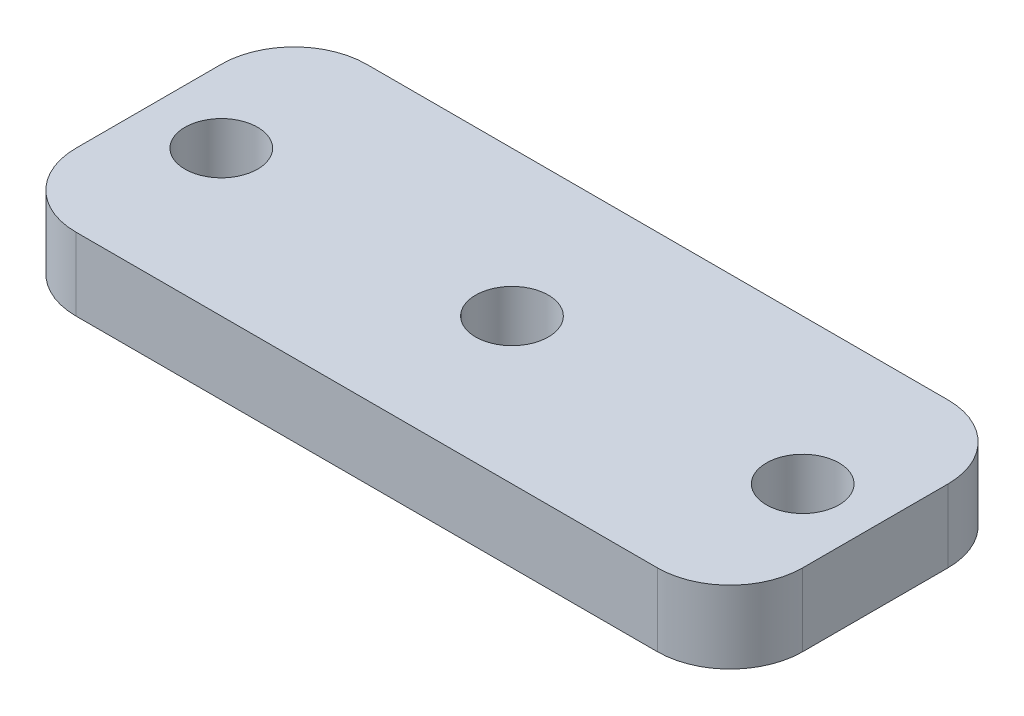
ISO-10303-21;
HEADER;
FILE_DESCRIPTION(('STEP AP214'),'2;1');
FILE_NAME('part.step','',(''),(''),'','','');
FILE_SCHEMA(('AUTOMOTIVE_DESIGN { 1 0 10303 214 1 1 1 1 }'));
ENDSEC;
DATA;
#1=APPLICATION_CONTEXT('core data for automotive mechanical design processes');
#2=APPLICATION_PROTOCOL_DEFINITION('international standard','automotive_design',2000,#1);
#3=PRODUCT_CONTEXT('',#1,'mechanical');
#4=PRODUCT('Part','Part','',(#3));
#5=PRODUCT_RELATED_PRODUCT_CATEGORY('part','',(#4));
#6=PRODUCT_DEFINITION_FORMATION('','',#4);
#7=PRODUCT_DEFINITION_CONTEXT('part definition',#1,'design');
#8=PRODUCT_DEFINITION('design','',#6,#7);
#9=PRODUCT_DEFINITION_SHAPE('','',#8);
#10=(LENGTH_UNIT() NAMED_UNIT(*) SI_UNIT(.MILLI.,.METRE.));
#11=(NAMED_UNIT(*) PLANE_ANGLE_UNIT() SI_UNIT($,.RADIAN.));
#12=(NAMED_UNIT(*) SI_UNIT($,.STERADIAN.) SOLID_ANGLE_UNIT());
#13=UNCERTAINTY_MEASURE_WITH_UNIT(LENGTH_MEASURE(1.E-05),#10,'distance_accuracy_value','');
#14=(GEOMETRIC_REPRESENTATION_CONTEXT(3) GLOBAL_UNCERTAINTY_ASSIGNED_CONTEXT((#13)) GLOBAL_UNIT_ASSIGNED_CONTEXT((#10,
#11,#12)) REPRESENTATION_CONTEXT('',''));
#15=CARTESIAN_POINT('',(0.,0.,0.));
#16=DIRECTION('',(0.,0.,1.));
#17=DIRECTION('',(1.,0.,0.));
#18=AXIS2_PLACEMENT_3D('',#15,#16,#17);
#19=CARTESIAN_POINT('',(0.,6.35,0.));
#20=DIRECTION('',(0.,-1.,0.));
#21=DIRECTION('',(0.,0.,-1.));
#22=AXIS2_PLACEMENT_3D('',#19,#20,#21);
#23=PLANE('',#22);
#24=CARTESIAN_POINT('',(31.75,6.35,-12.7));
#25=DIRECTION('',(0.,1.,0.));
#26=DIRECTION('',(0.,0.,1.));
#27=AXIS2_PLACEMENT_3D('',#24,#25,#26);
#28=CIRCLE('',#27,3.175);
#29=CARTESIAN_POINT('',(31.75,6.35,-9.525));
#30=VERTEX_POINT('',#29);
#31=EDGE_CURVE('E182',#30,#30,#28,.T.);
#32=ORIENTED_EDGE('',*,*,#31,.F.);
#33=EDGE_LOOP('',(#32));
#34=FACE_BOUND('',#33,.T.);
#35=DIRECTION('',(1.,0.,0.));
#36=VECTOR('',#35,1.);
#37=CARTESIAN_POINT('',(0.,6.35,0.));
#38=LINE('',#37,#36);
#39=CARTESIAN_POINT('',(6.35,6.35,0.));
#40=VERTEX_POINT('',#39);
#41=CARTESIAN_POINT('',(57.15,6.35,0.));
#42=VERTEX_POINT('',#41);
#43=EDGE_CURVE('E168',#40,#42,#38,.T.);
#44=ORIENTED_EDGE('',*,*,#43,.T.);
#45=CARTESIAN_POINT('',(57.15,6.35,-6.35));
#46=DIRECTION('',(0.,-1.,0.));
#47=DIRECTION('',(0.,0.,-1.));
#48=AXIS2_PLACEMENT_3D('',#45,#46,#47);
#49=CIRCLE('',#48,6.35);
#50=CARTESIAN_POINT('',(63.5,6.35,-6.35));
#51=VERTEX_POINT('',#50);
#52=EDGE_CURVE('E149',#42,#51,#49,.F.);
#53=ORIENTED_EDGE('',*,*,#52,.T.);
#54=DIRECTION('',(0.,0.,-1.));
#55=VECTOR('',#54,1.);
#56=CARTESIAN_POINT('',(63.5,6.35,0.));
#57=LINE('',#56,#55);
#58=CARTESIAN_POINT('',(63.5,6.35,-19.05));
#59=VERTEX_POINT('',#58);
#60=EDGE_CURVE('E119',#51,#59,#57,.T.);
#61=ORIENTED_EDGE('',*,*,#60,.T.);
#62=CARTESIAN_POINT('',(57.15,6.35,-19.05));
#63=DIRECTION('',(0.,-1.,0.));
#64=DIRECTION('',(0.,0.,-1.));
#65=AXIS2_PLACEMENT_3D('',#62,#63,#64);
#66=CIRCLE('',#65,6.35);
#67=CARTESIAN_POINT('',(57.15,6.35,-25.4));
#68=VERTEX_POINT('',#67);
#69=EDGE_CURVE('E55',#59,#68,#66,.F.);
#70=ORIENTED_EDGE('',*,*,#69,.T.);
#71=DIRECTION('',(-1.,0.,0.));
#72=VECTOR('',#71,1.);
#73=CARTESIAN_POINT('',(0.,6.35,-25.4));
#74=LINE('',#73,#72);
#75=CARTESIAN_POINT('',(6.35,6.35,-25.4));
#76=VERTEX_POINT('',#75);
#77=EDGE_CURVE('E135',#68,#76,#74,.T.);
#78=ORIENTED_EDGE('',*,*,#77,.T.);
#79=CARTESIAN_POINT('',(6.35,6.35,-19.05));
#80=DIRECTION('',(0.,-1.,0.));
#81=DIRECTION('',(0.,0.,-1.));
#82=AXIS2_PLACEMENT_3D('',#79,#80,#81);
#83=CIRCLE('',#82,6.35);
#84=CARTESIAN_POINT('',(0.,6.35,-19.05));
#85=VERTEX_POINT('',#84);
#86=EDGE_CURVE('E146',#76,#85,#83,.F.);
#87=ORIENTED_EDGE('',*,*,#86,.T.);
#88=DIRECTION('',(0.,0.,1.));
#89=VECTOR('',#88,1.);
#90=CARTESIAN_POINT('',(0.,6.35,0.));
#91=LINE('',#90,#89);
#92=CARTESIAN_POINT('',(0.,6.35,-6.35));
#93=VERTEX_POINT('',#92);
#94=EDGE_CURVE('E129',#85,#93,#91,.T.);
#95=ORIENTED_EDGE('',*,*,#94,.T.);
#96=CARTESIAN_POINT('',(6.35,6.35,-6.35));
#97=DIRECTION('',(0.,-1.,0.));
#98=DIRECTION('',(0.,0.,-1.));
#99=AXIS2_PLACEMENT_3D('',#96,#97,#98);
#100=CIRCLE('',#99,6.35);
#101=EDGE_CURVE('E144',#93,#40,#100,.F.);
#102=ORIENTED_EDGE('',*,*,#101,.T.);
#103=EDGE_LOOP('',(#44,#53,#61,#70,#78,#87,#95,#102));
#104=FACE_BOUND('',#103,.T.);
#105=CARTESIAN_POINT('',(6.35,6.35,-12.7));
#106=DIRECTION('',(0.,1.,0.));
#107=DIRECTION('',(0.,0.,1.));
#108=AXIS2_PLACEMENT_3D('',#105,#106,#107);
#109=CIRCLE('',#108,3.175);
#110=CARTESIAN_POINT('',(6.35,6.35,-9.525));
#111=VERTEX_POINT('',#110);
#112=EDGE_CURVE('E173',#111,#111,#109,.T.);
#113=ORIENTED_EDGE('',*,*,#112,.F.);
#114=EDGE_LOOP('',(#113));
#115=FACE_BOUND('',#114,.T.);
#116=CARTESIAN_POINT('',(57.15,6.35,-12.7));
#117=DIRECTION('',(0.,1.,0.));
#118=DIRECTION('',(0.,0.,-1.));
#119=AXIS2_PLACEMENT_3D('',#116,#117,#118);
#120=CIRCLE('',#119,3.175);
#121=CARTESIAN_POINT('',(57.15,6.35,-15.875));
#122=VERTEX_POINT('',#121);
#123=EDGE_CURVE('E187',#122,#122,#120,.T.);
#124=ORIENTED_EDGE('',*,*,#123,.F.);
#125=EDGE_LOOP('',(#124));
#126=FACE_BOUND('',#125,.T.);
#127=ADVANCED_FACE('F33',(#34,#104,#115,#126),#23,.F.);
#128=CARTESIAN_POINT('',(0.,0.,0.));
#129=DIRECTION('',(0.,-1.,0.));
#130=DIRECTION('',(0.,0.,-1.));
#131=AXIS2_PLACEMENT_3D('',#128,#129,#130);
#132=PLANE('',#131);
#133=CARTESIAN_POINT('',(31.75,0.,-12.7));
#134=DIRECTION('',(0.,1.,0.));
#135=DIRECTION('',(0.,0.,1.));
#136=AXIS2_PLACEMENT_3D('',#133,#134,#135);
#137=CIRCLE('',#136,3.175);
#138=CARTESIAN_POINT('',(31.75,0.,-9.525));
#139=VERTEX_POINT('',#138);
#140=EDGE_CURVE('E184',#139,#139,#137,.T.);
#141=ORIENTED_EDGE('',*,*,#140,.T.);
#142=EDGE_LOOP('',(#141));
#143=FACE_BOUND('',#142,.T.);
#144=DIRECTION('',(0.,0.,-1.));
#145=VECTOR('',#144,1.);
#146=CARTESIAN_POINT('',(63.5,0.,0.));
#147=LINE('',#146,#145);
#148=CARTESIAN_POINT('',(63.5,0.,-6.35));
#149=VERTEX_POINT('',#148);
#150=CARTESIAN_POINT('',(63.5,0.,-19.05));
#151=VERTEX_POINT('',#150);
#152=EDGE_CURVE('E117',#149,#151,#147,.T.);
#153=ORIENTED_EDGE('',*,*,#152,.F.);
#154=CARTESIAN_POINT('',(57.15,0.,-6.35));
#155=DIRECTION('',(0.,-1.,0.));
#156=DIRECTION('',(0.,0.,-1.));
#157=AXIS2_PLACEMENT_3D('',#154,#155,#156);
#158=CIRCLE('',#157,6.35);
#159=CARTESIAN_POINT('',(57.15,0.,0.));
#160=VERTEX_POINT('',#159);
#161=EDGE_CURVE('E100',#149,#160,#158,.T.);
#162=ORIENTED_EDGE('',*,*,#161,.T.);
#163=DIRECTION('',(1.,0.,0.));
#164=VECTOR('',#163,1.);
#165=CARTESIAN_POINT('',(0.,0.,0.));
#166=LINE('',#165,#164);
#167=CARTESIAN_POINT('',(6.35,0.,0.));
#168=VERTEX_POINT('',#167);
#169=EDGE_CURVE('E127',#168,#160,#166,.T.);
#170=ORIENTED_EDGE('',*,*,#169,.F.);
#171=CARTESIAN_POINT('',(6.35,0.,-6.35));
#172=DIRECTION('',(0.,-1.,0.));
#173=DIRECTION('',(0.,0.,-1.));
#174=AXIS2_PLACEMENT_3D('',#171,#172,#173);
#175=CIRCLE('',#174,6.35);
#176=CARTESIAN_POINT('',(0.,0.,-6.35));
#177=VERTEX_POINT('',#176);
#178=EDGE_CURVE('E120',#168,#177,#175,.T.);
#179=ORIENTED_EDGE('',*,*,#178,.T.);
#180=DIRECTION('',(0.,0.,1.));
#181=VECTOR('',#180,1.);
#182=CARTESIAN_POINT('',(0.,0.,0.));
#183=LINE('',#182,#181);
#184=CARTESIAN_POINT('',(0.,0.,-19.05));
#185=VERTEX_POINT('',#184);
#186=EDGE_CURVE('E131',#185,#177,#183,.T.);
#187=ORIENTED_EDGE('',*,*,#186,.F.);
#188=CARTESIAN_POINT('',(6.35,0.,-19.05));
#189=DIRECTION('',(0.,-1.,0.));
#190=DIRECTION('',(0.,0.,-1.));
#191=AXIS2_PLACEMENT_3D('',#188,#189,#190);
#192=CIRCLE('',#191,6.35);
#193=CARTESIAN_POINT('',(6.35,0.,-25.4));
#194=VERTEX_POINT('',#193);
#195=EDGE_CURVE('E138',#185,#194,#192,.T.);
#196=ORIENTED_EDGE('',*,*,#195,.T.);
#197=DIRECTION('',(-1.,0.,0.));
#198=VECTOR('',#197,1.);
#199=CARTESIAN_POINT('',(0.,0.,-25.4));
#200=LINE('',#199,#198);
#201=CARTESIAN_POINT('',(57.15,0.,-25.4));
#202=VERTEX_POINT('',#201);
#203=EDGE_CURVE('E126',#202,#194,#200,.T.);
#204=ORIENTED_EDGE('',*,*,#203,.F.);
#205=CARTESIAN_POINT('',(57.15,0.,-19.05));
#206=DIRECTION('',(0.,-1.,0.));
#207=DIRECTION('',(0.,0.,-1.));
#208=AXIS2_PLACEMENT_3D('',#205,#206,#207);
#209=CIRCLE('',#208,6.35);
#210=EDGE_CURVE('E111',#202,#151,#209,.T.);
#211=ORIENTED_EDGE('',*,*,#210,.T.);
#212=EDGE_LOOP('',(#153,#162,#170,#179,#187,#196,#204,#211));
#213=FACE_BOUND('',#212,.T.);
#214=CARTESIAN_POINT('',(6.35,0.,-12.7));
#215=DIRECTION('',(0.,1.,0.));
#216=DIRECTION('',(0.,0.,1.));
#217=AXIS2_PLACEMENT_3D('',#214,#215,#216);
#218=CIRCLE('',#217,3.175);
#219=CARTESIAN_POINT('',(6.35,0.,-9.525));
#220=VERTEX_POINT('',#219);
#221=EDGE_CURVE('E175',#220,#220,#218,.T.);
#222=ORIENTED_EDGE('',*,*,#221,.T.);
#223=EDGE_LOOP('',(#222));
#224=FACE_BOUND('',#223,.T.);
#225=CARTESIAN_POINT('',(57.15,0.,-12.7));
#226=DIRECTION('',(0.,1.,0.));
#227=DIRECTION('',(0.,0.,-1.));
#228=AXIS2_PLACEMENT_3D('',#225,#226,#227);
#229=CIRCLE('',#228,3.175);
#230=CARTESIAN_POINT('',(57.15,0.,-15.875));
#231=VERTEX_POINT('',#230);
#232=EDGE_CURVE('E190',#231,#231,#229,.T.);
#233=ORIENTED_EDGE('',*,*,#232,.T.);
#234=EDGE_LOOP('',(#233));
#235=FACE_BOUND('',#234,.T.);
#236=ADVANCED_FACE('F123',(#143,#213,#224,#235),#132,.T.);
#237=CARTESIAN_POINT('',(0.,6.35,0.));
#238=DIRECTION('',(1.,0.,0.));
#239=DIRECTION('',(0.,0.,-1.));
#240=AXIS2_PLACEMENT_3D('',#237,#238,#239);
#241=PLANE('',#240);
#242=ORIENTED_EDGE('',*,*,#94,.F.);
#243=DIRECTION('',(0.,-1.,0.));
#244=VECTOR('',#243,1.);
#245=CARTESIAN_POINT('',(0.,6.35,-19.05));
#246=LINE('',#245,#244);
#247=EDGE_CURVE('E11',#85,#185,#246,.T.);
#248=ORIENTED_EDGE('',*,*,#247,.T.);
#249=ORIENTED_EDGE('',*,*,#186,.T.);
#250=DIRECTION('',(0.,-1.,0.));
#251=VECTOR('',#250,1.);
#252=CARTESIAN_POINT('',(0.,6.35,-6.35));
#253=LINE('',#252,#251);
#254=EDGE_CURVE('E41',#177,#93,#253,.F.);
#255=ORIENTED_EDGE('',*,*,#254,.T.);
#256=EDGE_LOOP('',(#242,#248,#249,#255));
#257=FACE_BOUND('',#256,.T.);
#258=ADVANCED_FACE('F159',(#257),#241,.F.);
#259=CARTESIAN_POINT('',(0.,6.35,0.));
#260=DIRECTION('',(0.,0.,-1.));
#261=DIRECTION('',(-1.,0.,0.));
#262=AXIS2_PLACEMENT_3D('',#259,#260,#261);
#263=PLANE('',#262);
#264=ORIENTED_EDGE('',*,*,#169,.T.);
#265=DIRECTION('',(0.,-1.,0.));
#266=VECTOR('',#265,1.);
#267=CARTESIAN_POINT('',(57.15,6.35,0.));
#268=LINE('',#267,#266);
#269=EDGE_CURVE('E105',#160,#42,#268,.F.);
#270=ORIENTED_EDGE('',*,*,#269,.T.);
#271=ORIENTED_EDGE('',*,*,#43,.F.);
#272=DIRECTION('',(0.,-1.,0.));
#273=VECTOR('',#272,1.);
#274=CARTESIAN_POINT('',(6.35,6.35,0.));
#275=LINE('',#274,#273);
#276=EDGE_CURVE('E110',#40,#168,#275,.T.);
#277=ORIENTED_EDGE('',*,*,#276,.T.);
#278=EDGE_LOOP('',(#264,#270,#271,#277));
#279=FACE_BOUND('',#278,.T.);
#280=ADVANCED_FACE('F172',(#279),#263,.F.);
#281=CARTESIAN_POINT('',(63.5,6.35,0.));
#282=DIRECTION('',(-1.,0.,0.));
#283=DIRECTION('',(0.,0.,1.));
#284=AXIS2_PLACEMENT_3D('',#281,#282,#283);
#285=PLANE('',#284);
#286=ORIENTED_EDGE('',*,*,#60,.F.);
#287=DIRECTION('',(0.,-1.,0.));
#288=VECTOR('',#287,1.);
#289=CARTESIAN_POINT('',(63.5,6.35,-6.35));
#290=LINE('',#289,#288);
#291=EDGE_CURVE('E104',#51,#149,#290,.T.);
#292=ORIENTED_EDGE('',*,*,#291,.T.);
#293=ORIENTED_EDGE('',*,*,#152,.T.);
#294=DIRECTION('',(0.,-1.,0.));
#295=VECTOR('',#294,1.);
#296=CARTESIAN_POINT('',(63.5,6.35,-19.05));
#297=LINE('',#296,#295);
#298=EDGE_CURVE('E121',#151,#59,#297,.F.);
#299=ORIENTED_EDGE('',*,*,#298,.T.);
#300=EDGE_LOOP('',(#286,#292,#293,#299));
#301=FACE_BOUND('',#300,.T.);
#302=ADVANCED_FACE('F116',(#301),#285,.F.);
#303=CARTESIAN_POINT('',(0.,6.35,-25.4));
#304=DIRECTION('',(0.,0.,1.));
#305=DIRECTION('',(1.,0.,0.));
#306=AXIS2_PLACEMENT_3D('',#303,#304,#305);
#307=PLANE('',#306);
#308=ORIENTED_EDGE('',*,*,#77,.F.);
#309=DIRECTION('',(0.,-1.,0.));
#310=VECTOR('',#309,1.);
#311=CARTESIAN_POINT('',(57.15,6.35,-25.4));
#312=LINE('',#311,#310);
#313=EDGE_CURVE('E152',#68,#202,#312,.T.);
#314=ORIENTED_EDGE('',*,*,#313,.T.);
#315=ORIENTED_EDGE('',*,*,#203,.T.);
#316=DIRECTION('',(0.,-1.,0.));
#317=VECTOR('',#316,1.);
#318=CARTESIAN_POINT('',(6.35,6.35,-25.4));
#319=LINE('',#318,#317);
#320=EDGE_CURVE('E48',#194,#76,#319,.F.);
#321=ORIENTED_EDGE('',*,*,#320,.T.);
#322=EDGE_LOOP('',(#308,#314,#315,#321));
#323=FACE_BOUND('',#322,.T.);
#324=ADVANCED_FACE('F212',(#323),#307,.F.);
#325=CARTESIAN_POINT('',(6.35,6.35,-12.7));
#326=DIRECTION('',(0.,-1.,0.));
#327=DIRECTION('',(0.,0.,-1.));
#328=AXIS2_PLACEMENT_3D('',#325,#326,#327);
#329=CYLINDRICAL_SURFACE('',#328,3.175);
#330=ORIENTED_EDGE('',*,*,#112,.T.);
#331=EDGE_LOOP('',(#330));
#332=FACE_BOUND('',#331,.T.);
#333=ORIENTED_EDGE('',*,*,#221,.F.);
#334=EDGE_LOOP('',(#333));
#335=FACE_BOUND('',#334,.T.);
#336=ADVANCED_FACE('F209',(#332,#335),#329,.F.);
#337=CARTESIAN_POINT('',(31.75,6.35,-12.7));
#338=DIRECTION('',(0.,-1.,0.));
#339=DIRECTION('',(0.,0.,-1.));
#340=AXIS2_PLACEMENT_3D('',#337,#338,#339);
#341=CYLINDRICAL_SURFACE('',#340,3.175);
#342=ORIENTED_EDGE('',*,*,#31,.T.);
#343=EDGE_LOOP('',(#342));
#344=FACE_BOUND('',#343,.T.);
#345=ORIENTED_EDGE('',*,*,#140,.F.);
#346=EDGE_LOOP('',(#345));
#347=FACE_BOUND('',#346,.T.);
#348=ADVANCED_FACE('F295',(#344,#347),#341,.F.);
#349=CARTESIAN_POINT('',(57.15,6.35,-12.7));
#350=DIRECTION('',(0.,-1.,0.));
#351=DIRECTION('',(0.,0.,-1.));
#352=AXIS2_PLACEMENT_3D('',#349,#350,#351);
#353=CYLINDRICAL_SURFACE('',#352,3.175);
#354=ORIENTED_EDGE('',*,*,#123,.T.);
#355=EDGE_LOOP('',(#354));
#356=FACE_BOUND('',#355,.T.);
#357=ORIENTED_EDGE('',*,*,#232,.F.);
#358=EDGE_LOOP('',(#357));
#359=FACE_BOUND('',#358,.T.);
#360=ADVANCED_FACE('F196',(#356,#359),#353,.F.);
#361=CARTESIAN_POINT('',(57.15,6.35,-6.35));
#362=DIRECTION('',(0.,-1.,0.));
#363=DIRECTION('',(0.,0.,-1.));
#364=AXIS2_PLACEMENT_3D('',#361,#362,#363);
#365=CYLINDRICAL_SURFACE('',#364,6.35);
#366=ORIENTED_EDGE('',*,*,#52,.F.);
#367=ORIENTED_EDGE('',*,*,#269,.F.);
#368=ORIENTED_EDGE('',*,*,#161,.F.);
#369=ORIENTED_EDGE('',*,*,#291,.F.);
#370=EDGE_LOOP('',(#366,#367,#368,#369));
#371=FACE_BOUND('',#370,.T.);
#372=ADVANCED_FACE('F103',(#371),#365,.T.);
#373=CARTESIAN_POINT('',(57.15,6.35,-19.05));
#374=DIRECTION('',(0.,-1.,0.));
#375=DIRECTION('',(0.,0.,-1.));
#376=AXIS2_PLACEMENT_3D('',#373,#374,#375);
#377=CYLINDRICAL_SURFACE('',#376,6.35);
#378=ORIENTED_EDGE('',*,*,#69,.F.);
#379=ORIENTED_EDGE('',*,*,#298,.F.);
#380=ORIENTED_EDGE('',*,*,#210,.F.);
#381=ORIENTED_EDGE('',*,*,#313,.F.);
#382=EDGE_LOOP('',(#378,#379,#380,#381));
#383=FACE_BOUND('',#382,.T.);
#384=ADVANCED_FACE('F223',(#383),#377,.T.);
#385=CARTESIAN_POINT('',(6.35,6.35,-19.05));
#386=DIRECTION('',(0.,-1.,0.));
#387=DIRECTION('',(0.,0.,-1.));
#388=AXIS2_PLACEMENT_3D('',#385,#386,#387);
#389=CYLINDRICAL_SURFACE('',#388,6.35);
#390=ORIENTED_EDGE('',*,*,#86,.F.);
#391=ORIENTED_EDGE('',*,*,#320,.F.);
#392=ORIENTED_EDGE('',*,*,#195,.F.);
#393=ORIENTED_EDGE('',*,*,#247,.F.);
#394=EDGE_LOOP('',(#390,#391,#392,#393));
#395=FACE_BOUND('',#394,.T.);
#396=ADVANCED_FACE('F225',(#395),#389,.T.);
#397=CARTESIAN_POINT('',(6.35,6.35,-6.35));
#398=DIRECTION('',(0.,-1.,0.));
#399=DIRECTION('',(0.,0.,-1.));
#400=AXIS2_PLACEMENT_3D('',#397,#398,#399);
#401=CYLINDRICAL_SURFACE('',#400,6.35);
#402=ORIENTED_EDGE('',*,*,#101,.F.);
#403=ORIENTED_EDGE('',*,*,#254,.F.);
#404=ORIENTED_EDGE('',*,*,#178,.F.);
#405=ORIENTED_EDGE('',*,*,#276,.F.);
#406=EDGE_LOOP('',(#402,#403,#404,#405));
#407=FACE_BOUND('',#406,.T.);
#408=ADVANCED_FACE('F35',(#407),#401,.T.);
#409=CLOSED_SHELL('',(#127,#236,#258,#280,#302,#324,#336,#348,#360,#372,#384,#396,#408));
#410=MANIFOLD_SOLID_BREP('B2',#409);
#411=ADVANCED_BREP_SHAPE_REPRESENTATION('',(#18,#410),#14);
#412=SHAPE_DEFINITION_REPRESENTATION(#9,#411);
ENDSEC;
END-ISO-10303-21;
